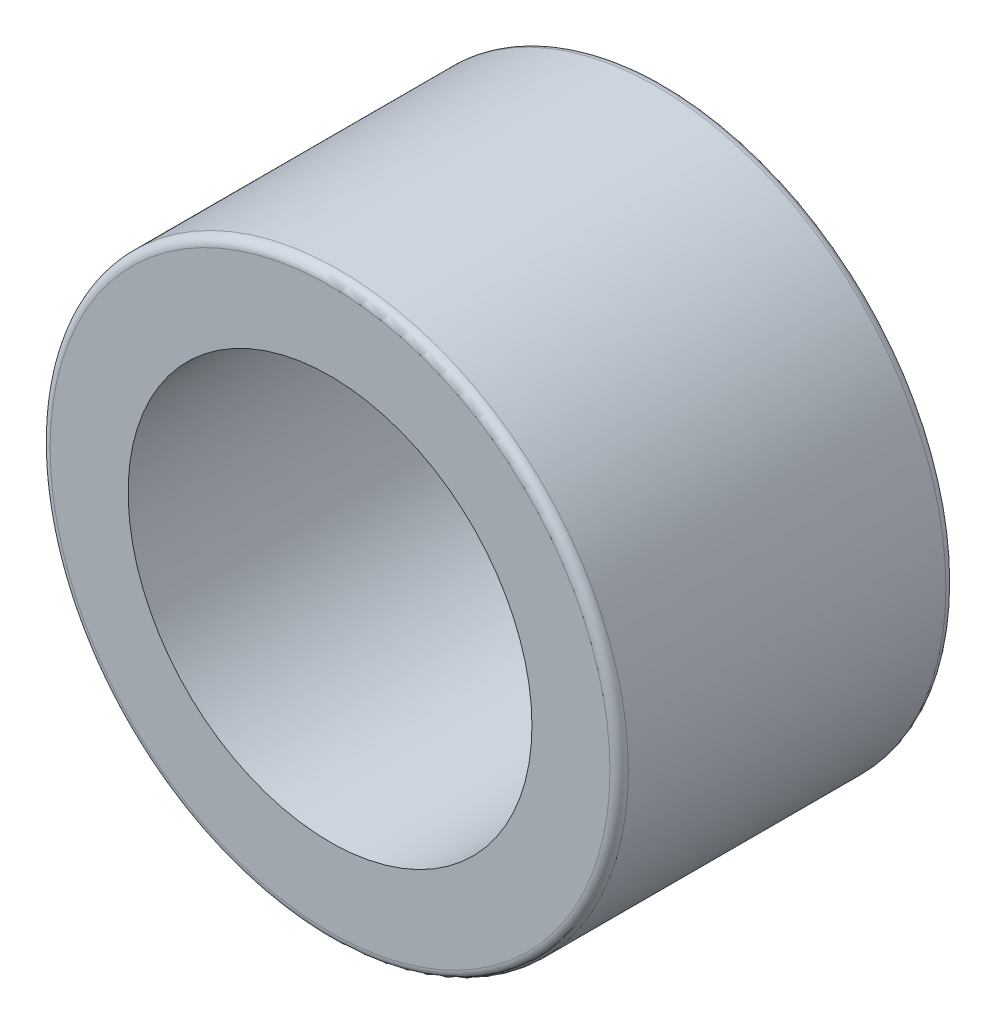
ISO-10303-21;
HEADER;
FILE_DESCRIPTION(('STEP AP214'),'2;1');
FILE_NAME('part.step','',(''),(''),'','','');
FILE_SCHEMA(('AUTOMOTIVE_DESIGN { 1 0 10303 214 1 1 1 1 }'));
ENDSEC;
DATA;
#1=APPLICATION_CONTEXT('core data for automotive mechanical design processes');
#2=APPLICATION_PROTOCOL_DEFINITION('international standard','automotive_design',2000,#1);
#3=PRODUCT_CONTEXT('',#1,'mechanical');
#4=PRODUCT('Part','Part','',(#3));
#5=PRODUCT_RELATED_PRODUCT_CATEGORY('part','',(#4));
#6=PRODUCT_DEFINITION_FORMATION('','',#4);
#7=PRODUCT_DEFINITION_CONTEXT('part definition',#1,'design');
#8=PRODUCT_DEFINITION('design','',#6,#7);
#9=PRODUCT_DEFINITION_SHAPE('','',#8);
#10=(LENGTH_UNIT() NAMED_UNIT(*) SI_UNIT(.MILLI.,.METRE.));
#11=(NAMED_UNIT(*) PLANE_ANGLE_UNIT() SI_UNIT($,.RADIAN.));
#12=(NAMED_UNIT(*) SI_UNIT($,.STERADIAN.) SOLID_ANGLE_UNIT());
#13=UNCERTAINTY_MEASURE_WITH_UNIT(LENGTH_MEASURE(1.E-05),#10,'distance_accuracy_value','');
#14=(GEOMETRIC_REPRESENTATION_CONTEXT(3) GLOBAL_UNCERTAINTY_ASSIGNED_CONTEXT((#13)) GLOBAL_UNIT_ASSIGNED_CONTEXT((#10,
#11,#12)) REPRESENTATION_CONTEXT('',''));
#15=CARTESIAN_POINT('',(0.,0.,0.));
#16=DIRECTION('',(0.,0.,1.));
#17=DIRECTION('',(1.,0.,0.));
#18=AXIS2_PLACEMENT_3D('',#15,#16,#17);
#19=CARTESIAN_POINT('',(0.,0.,36.6));
#20=DIRECTION('',(0.,0.,1.));
#21=DIRECTION('',(1.,0.,0.));
#22=AXIS2_PLACEMENT_3D('',#19,#20,#21);
#23=PLANE('',#22);
#24=CARTESIAN_POINT('',(0.,0.,36.6));
#25=DIRECTION('',(0.,0.,1.));
#26=DIRECTION('',(1.,0.,0.));
#27=AXIS2_PLACEMENT_3D('',#24,#25,#26);
#28=CIRCLE('',#27,30.5);
#29=CARTESIAN_POINT('',(30.5,0.,36.6));
#30=VERTEX_POINT('',#29);
#31=EDGE_CURVE('E10',#30,#30,#28,.T.);
#32=ORIENTED_EDGE('',*,*,#31,.T.);
#33=EDGE_LOOP('',(#32));
#34=FACE_BOUND('',#33,.T.);
#35=CARTESIAN_POINT('',(0.,0.,36.6));
#36=DIRECTION('',(0.,0.,1.));
#37=DIRECTION('',(1.,0.,0.));
#38=AXIS2_PLACEMENT_3D('',#35,#36,#37);
#39=CIRCLE('',#38,22.);
#40=CARTESIAN_POINT('',(22.,0.,36.6));
#41=VERTEX_POINT('',#40);
#42=EDGE_CURVE('E51',#41,#41,#39,.T.);
#43=ORIENTED_EDGE('',*,*,#42,.F.);
#44=EDGE_LOOP('',(#43));
#45=FACE_BOUND('',#44,.T.);
#46=ADVANCED_FACE('F31',(#34,#45),#23,.T.);
#47=CARTESIAN_POINT('',(0.,0.,0.));
#48=DIRECTION('',(0.,0.,1.));
#49=DIRECTION('',(1.,0.,0.));
#50=AXIS2_PLACEMENT_3D('',#47,#48,#49);
#51=PLANE('',#50);
#52=CARTESIAN_POINT('',(0.,0.,0.));
#53=DIRECTION('',(0.,0.,1.));
#54=DIRECTION('',(1.,0.,0.));
#55=AXIS2_PLACEMENT_3D('',#52,#53,#54);
#56=CIRCLE('',#55,30.5);
#57=CARTESIAN_POINT('',(30.5,0.,0.));
#58=VERTEX_POINT('',#57);
#59=EDGE_CURVE('E38',#58,#58,#56,.F.);
#60=ORIENTED_EDGE('',*,*,#59,.T.);
#61=EDGE_LOOP('',(#60));
#62=FACE_BOUND('',#61,.T.);
#63=CARTESIAN_POINT('',(0.,0.,0.));
#64=DIRECTION('',(0.,0.,1.));
#65=DIRECTION('',(1.,0.,0.));
#66=AXIS2_PLACEMENT_3D('',#63,#64,#65);
#67=CIRCLE('',#66,22.);
#68=CARTESIAN_POINT('',(22.,0.,0.));
#69=VERTEX_POINT('',#68);
#70=EDGE_CURVE('E52',#69,#69,#67,.T.);
#71=ORIENTED_EDGE('',*,*,#70,.T.);
#72=EDGE_LOOP('',(#71));
#73=FACE_BOUND('',#72,.T.);
#74=ADVANCED_FACE('F62',(#62,#73),#51,.F.);
#75=CARTESIAN_POINT('',(0.,0.,36.6));
#76=DIRECTION('',(0.,0.,-1.));
#77=DIRECTION('',(-1.,0.,0.));
#78=AXIS2_PLACEMENT_3D('',#75,#76,#77);
#79=CYLINDRICAL_SURFACE('',#78,31.5);
#80=CARTESIAN_POINT('',(0.,0.,1.));
#81=DIRECTION('',(0.,0.,1.));
#82=DIRECTION('',(1.,0.,0.));
#83=AXIS2_PLACEMENT_3D('',#80,#81,#82);
#84=CIRCLE('',#83,31.5);
#85=CARTESIAN_POINT('',(31.5,0.,1.));
#86=VERTEX_POINT('',#85);
#87=EDGE_CURVE('E42',#86,#86,#84,.T.);
#88=ORIENTED_EDGE('',*,*,#87,.T.);
#89=EDGE_LOOP('',(#88));
#90=FACE_BOUND('',#89,.T.);
#91=CARTESIAN_POINT('',(0.,0.,35.6));
#92=DIRECTION('',(0.,0.,1.));
#93=DIRECTION('',(1.,0.,0.));
#94=AXIS2_PLACEMENT_3D('',#91,#92,#93);
#95=CIRCLE('',#94,31.5);
#96=CARTESIAN_POINT('',(31.5,0.,35.6));
#97=VERTEX_POINT('',#96);
#98=EDGE_CURVE('E46',#97,#97,#95,.F.);
#99=ORIENTED_EDGE('',*,*,#98,.T.);
#100=EDGE_LOOP('',(#99));
#101=FACE_BOUND('',#100,.T.);
#102=ADVANCED_FACE('F67',(#90,#101),#79,.T.);
#103=CARTESIAN_POINT('',(0.,0.,36.6));
#104=DIRECTION('',(0.,0.,-1.));
#105=DIRECTION('',(-1.,0.,0.));
#106=AXIS2_PLACEMENT_3D('',#103,#104,#105);
#107=CYLINDRICAL_SURFACE('',#106,22.);
#108=ORIENTED_EDGE('',*,*,#42,.T.);
#109=EDGE_LOOP('',(#108));
#110=FACE_BOUND('',#109,.T.);
#111=ORIENTED_EDGE('',*,*,#70,.F.);
#112=EDGE_LOOP('',(#111));
#113=FACE_BOUND('',#112,.T.);
#114=ADVANCED_FACE('F58',(#110,#113),#107,.F.);
#115=CARTESIAN_POINT('',(0.,0.,1.));
#116=DIRECTION('',(0.,0.,1.));
#117=DIRECTION('',(1.,0.,0.));
#118=AXIS2_PLACEMENT_3D('',#115,#116,#117);
#119=TOROIDAL_SURFACE('',#118,30.5,1.);
#120=ORIENTED_EDGE('',*,*,#59,.F.);
#121=EDGE_LOOP('',(#120));
#122=FACE_BOUND('',#121,.T.);
#123=ORIENTED_EDGE('',*,*,#87,.F.);
#124=EDGE_LOOP('',(#123));
#125=FACE_BOUND('',#124,.T.);
#126=ADVANCED_FACE('F73',(#122,#125),#119,.T.);
#127=CARTESIAN_POINT('',(0.,0.,35.6));
#128=DIRECTION('',(0.,0.,1.));
#129=DIRECTION('',(1.,0.,0.));
#130=AXIS2_PLACEMENT_3D('',#127,#128,#129);
#131=TOROIDAL_SURFACE('',#130,30.5,1.);
#132=ORIENTED_EDGE('',*,*,#98,.F.);
#133=EDGE_LOOP('',(#132));
#134=FACE_BOUND('',#133,.T.);
#135=ORIENTED_EDGE('',*,*,#31,.F.);
#136=EDGE_LOOP('',(#135));
#137=FACE_BOUND('',#136,.T.);
#138=ADVANCED_FACE('F33',(#134,#137),#131,.T.);
#139=CLOSED_SHELL('',(#46,#74,#102,#114,#126,#138));
#140=MANIFOLD_SOLID_BREP('B2',#139);
#141=ADVANCED_BREP_SHAPE_REPRESENTATION('',(#18,#140),#14);
#142=SHAPE_DEFINITION_REPRESENTATION(#9,#141);
ENDSEC;
END-ISO-10303-21;
